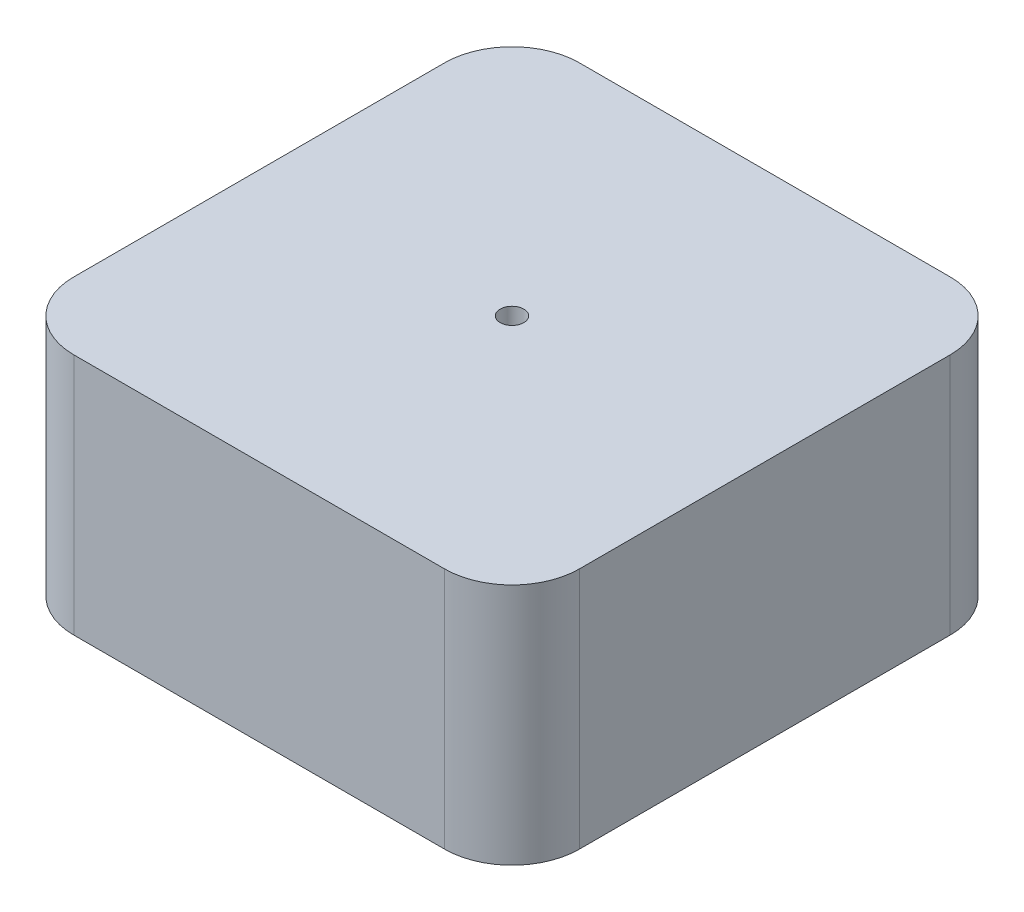
ISO-10303-21;
HEADER;
FILE_DESCRIPTION(('STEP AP214'),'2;1');
FILE_NAME('part.step','',(''),(''),'','','');
FILE_SCHEMA(('AUTOMOTIVE_DESIGN { 1 0 10303 214 1 1 1 1 }'));
ENDSEC;
DATA;
#1=APPLICATION_CONTEXT('core data for automotive mechanical design processes');
#2=APPLICATION_PROTOCOL_DEFINITION('international standard','automotive_design',2000,#1);
#3=PRODUCT_CONTEXT('',#1,'mechanical');
#4=PRODUCT('Part','Part','',(#3));
#5=PRODUCT_RELATED_PRODUCT_CATEGORY('part','',(#4));
#6=PRODUCT_DEFINITION_FORMATION('','',#4);
#7=PRODUCT_DEFINITION_CONTEXT('part definition',#1,'design');
#8=PRODUCT_DEFINITION('design','',#6,#7);
#9=PRODUCT_DEFINITION_SHAPE('','',#8);
#10=(LENGTH_UNIT() NAMED_UNIT(*) SI_UNIT(.MILLI.,.METRE.));
#11=(NAMED_UNIT(*) PLANE_ANGLE_UNIT() SI_UNIT($,.RADIAN.));
#12=(NAMED_UNIT(*) SI_UNIT($,.STERADIAN.) SOLID_ANGLE_UNIT());
#13=UNCERTAINTY_MEASURE_WITH_UNIT(LENGTH_MEASURE(1.E-05),#10,'distance_accuracy_value','');
#14=(GEOMETRIC_REPRESENTATION_CONTEXT(3) GLOBAL_UNCERTAINTY_ASSIGNED_CONTEXT((#13)) GLOBAL_UNIT_ASSIGNED_CONTEXT((#10,
#11,#12)) REPRESENTATION_CONTEXT('',''));
#15=CARTESIAN_POINT('',(0.,0.,0.));
#16=DIRECTION('',(0.,0.,1.));
#17=DIRECTION('',(1.,0.,0.));
#18=AXIS2_PLACEMENT_3D('',#15,#16,#17);
#19=CARTESIAN_POINT('',(-55.,-72.,55.));
#20=DIRECTION('',(0.,1.,0.));
#21=DIRECTION('',(0.,0.,1.));
#22=AXIS2_PLACEMENT_3D('',#19,#20,#21);
#23=CYLINDRICAL_SURFACE('',#22,20.);
#24=CARTESIAN_POINT('',(-55.,0.,55.));
#25=DIRECTION('',(0.,1.,0.));
#26=DIRECTION('',(0.,0.,1.));
#27=AXIS2_PLACEMENT_3D('',#24,#25,#26);
#28=CIRCLE('',#27,20.);
#29=CARTESIAN_POINT('',(-75.,0.,55.));
#30=VERTEX_POINT('',#29);
#31=CARTESIAN_POINT('',(-55.,0.,75.));
#32=VERTEX_POINT('',#31);
#33=EDGE_CURVE('E154',#30,#32,#28,.T.);
#34=ORIENTED_EDGE('',*,*,#33,.F.);
#35=DIRECTION('',(0.,1.,0.));
#36=VECTOR('',#35,1.);
#37=CARTESIAN_POINT('',(-75.,-72.,55.));
#38=LINE('',#37,#36);
#39=CARTESIAN_POINT('',(-75.,-72.,55.));
#40=VERTEX_POINT('',#39);
#41=EDGE_CURVE('E11',#40,#30,#38,.T.);
#42=ORIENTED_EDGE('',*,*,#41,.F.);
#43=CARTESIAN_POINT('',(-55.,-72.,55.));
#44=DIRECTION('',(0.,1.,0.));
#45=DIRECTION('',(0.,0.,1.));
#46=AXIS2_PLACEMENT_3D('',#43,#44,#45);
#47=CIRCLE('',#46,20.);
#48=CARTESIAN_POINT('',(-55.,-72.,75.));
#49=VERTEX_POINT('',#48);
#50=EDGE_CURVE('E178',#40,#49,#47,.T.);
#51=ORIENTED_EDGE('',*,*,#50,.T.);
#52=DIRECTION('',(0.,1.,0.));
#53=VECTOR('',#52,1.);
#54=CARTESIAN_POINT('',(-55.,-72.,75.));
#55=LINE('',#54,#53);
#56=EDGE_CURVE('E106',#49,#32,#55,.T.);
#57=ORIENTED_EDGE('',*,*,#56,.T.);
#58=EDGE_LOOP('',(#34,#42,#51,#57));
#59=FACE_BOUND('',#58,.T.);
#60=ADVANCED_FACE('F42',(#59),#23,.T.);
#61=CARTESIAN_POINT('',(-75.,-72.,55.));
#62=DIRECTION('',(-1.,0.,0.));
#63=DIRECTION('',(0.,0.,1.));
#64=AXIS2_PLACEMENT_3D('',#61,#62,#63);
#65=PLANE('',#64);
#66=DIRECTION('',(0.,0.,1.));
#67=VECTOR('',#66,1.);
#68=CARTESIAN_POINT('',(-75.,0.,55.));
#69=LINE('',#68,#67);
#70=CARTESIAN_POINT('',(-75.,0.,-55.));
#71=VERTEX_POINT('',#70);
#72=EDGE_CURVE('E171',#71,#30,#69,.T.);
#73=ORIENTED_EDGE('',*,*,#72,.F.);
#74=DIRECTION('',(0.,1.,0.));
#75=VECTOR('',#74,1.);
#76=CARTESIAN_POINT('',(-75.,-72.,-55.));
#77=LINE('',#76,#75);
#78=CARTESIAN_POINT('',(-75.,-72.,-55.));
#79=VERTEX_POINT('',#78);
#80=EDGE_CURVE('E55',#79,#71,#77,.T.);
#81=ORIENTED_EDGE('',*,*,#80,.F.);
#82=DIRECTION('',(0.,0.,1.));
#83=VECTOR('',#82,1.);
#84=CARTESIAN_POINT('',(-75.,-72.,55.));
#85=LINE('',#84,#83);
#86=EDGE_CURVE('E144',#79,#40,#85,.T.);
#87=ORIENTED_EDGE('',*,*,#86,.T.);
#88=ORIENTED_EDGE('',*,*,#41,.T.);
#89=EDGE_LOOP('',(#73,#81,#87,#88));
#90=FACE_BOUND('',#89,.T.);
#91=ADVANCED_FACE('F186',(#90),#65,.T.);
#92=CARTESIAN_POINT('',(-55.,-72.,-55.));
#93=DIRECTION('',(0.,1.,0.));
#94=DIRECTION('',(0.,0.,1.));
#95=AXIS2_PLACEMENT_3D('',#92,#93,#94);
#96=CYLINDRICAL_SURFACE('',#95,20.);
#97=CARTESIAN_POINT('',(-55.,0.,-55.));
#98=DIRECTION('',(0.,1.,0.));
#99=DIRECTION('',(0.,0.,-1.));
#100=AXIS2_PLACEMENT_3D('',#97,#98,#99);
#101=CIRCLE('',#100,20.);
#102=CARTESIAN_POINT('',(-55.,0.,-75.));
#103=VERTEX_POINT('',#102);
#104=EDGE_CURVE('E135',#103,#71,#101,.T.);
#105=ORIENTED_EDGE('',*,*,#104,.F.);
#106=DIRECTION('',(0.,1.,0.));
#107=VECTOR('',#106,1.);
#108=CARTESIAN_POINT('',(-55.,-72.,-75.));
#109=LINE('',#108,#107);
#110=CARTESIAN_POINT('',(-55.,-72.,-75.));
#111=VERTEX_POINT('',#110);
#112=EDGE_CURVE('E127',#111,#103,#109,.T.);
#113=ORIENTED_EDGE('',*,*,#112,.F.);
#114=CARTESIAN_POINT('',(-55.,-72.,-55.));
#115=DIRECTION('',(0.,1.,0.));
#116=DIRECTION('',(0.,0.,-1.));
#117=AXIS2_PLACEMENT_3D('',#114,#115,#116);
#118=CIRCLE('',#117,20.);
#119=EDGE_CURVE('E129',#111,#79,#118,.T.);
#120=ORIENTED_EDGE('',*,*,#119,.T.);
#121=ORIENTED_EDGE('',*,*,#80,.T.);
#122=EDGE_LOOP('',(#105,#113,#120,#121));
#123=FACE_BOUND('',#122,.T.);
#124=ADVANCED_FACE('F126',(#123),#96,.T.);
#125=CARTESIAN_POINT('',(-55.,-72.,-75.));
#126=DIRECTION('',(0.,0.,-1.));
#127=DIRECTION('',(-1.,0.,0.));
#128=AXIS2_PLACEMENT_3D('',#125,#126,#127);
#129=PLANE('',#128);
#130=DIRECTION('',(-1.,0.,0.));
#131=VECTOR('',#130,1.);
#132=CARTESIAN_POINT('',(-55.,0.,-75.));
#133=LINE('',#132,#131);
#134=CARTESIAN_POINT('',(55.,0.,-75.));
#135=VERTEX_POINT('',#134);
#136=EDGE_CURVE('E172',#135,#103,#133,.T.);
#137=ORIENTED_EDGE('',*,*,#136,.F.);
#138=DIRECTION('',(0.,1.,0.));
#139=VECTOR('',#138,1.);
#140=CARTESIAN_POINT('',(55.,-72.,-75.));
#141=LINE('',#140,#139);
#142=CARTESIAN_POINT('',(55.,-72.,-75.));
#143=VERTEX_POINT('',#142);
#144=EDGE_CURVE('E137',#143,#135,#141,.T.);
#145=ORIENTED_EDGE('',*,*,#144,.F.);
#146=DIRECTION('',(-1.,0.,0.));
#147=VECTOR('',#146,1.);
#148=CARTESIAN_POINT('',(-55.,-72.,-75.));
#149=LINE('',#148,#147);
#150=EDGE_CURVE('E141',#143,#111,#149,.T.);
#151=ORIENTED_EDGE('',*,*,#150,.T.);
#152=ORIENTED_EDGE('',*,*,#112,.T.);
#153=EDGE_LOOP('',(#137,#145,#151,#152));
#154=FACE_BOUND('',#153,.T.);
#155=ADVANCED_FACE('F150',(#154),#129,.T.);
#156=CARTESIAN_POINT('',(55.,-72.,-55.));
#157=DIRECTION('',(0.,1.,0.));
#158=DIRECTION('',(0.,0.,1.));
#159=AXIS2_PLACEMENT_3D('',#156,#157,#158);
#160=CYLINDRICAL_SURFACE('',#159,20.);
#161=CARTESIAN_POINT('',(55.,0.,-55.));
#162=DIRECTION('',(0.,1.,0.));
#163=DIRECTION('',(0.,0.,1.));
#164=AXIS2_PLACEMENT_3D('',#161,#162,#163);
#165=CIRCLE('',#164,20.);
#166=CARTESIAN_POINT('',(75.,0.,-55.));
#167=VERTEX_POINT('',#166);
#168=EDGE_CURVE('E169',#167,#135,#165,.T.);
#169=ORIENTED_EDGE('',*,*,#168,.F.);
#170=DIRECTION('',(0.,1.,0.));
#171=VECTOR('',#170,1.);
#172=CARTESIAN_POINT('',(75.,-72.,-55.));
#173=LINE('',#172,#171);
#174=CARTESIAN_POINT('',(75.,-72.,-55.));
#175=VERTEX_POINT('',#174);
#176=EDGE_CURVE('E177',#175,#167,#173,.T.);
#177=ORIENTED_EDGE('',*,*,#176,.F.);
#178=CARTESIAN_POINT('',(55.,-72.,-55.));
#179=DIRECTION('',(0.,1.,0.));
#180=DIRECTION('',(0.,0.,1.));
#181=AXIS2_PLACEMENT_3D('',#178,#179,#180);
#182=CIRCLE('',#181,20.);
#183=EDGE_CURVE('E146',#175,#143,#182,.T.);
#184=ORIENTED_EDGE('',*,*,#183,.T.);
#185=ORIENTED_EDGE('',*,*,#144,.T.);
#186=EDGE_LOOP('',(#169,#177,#184,#185));
#187=FACE_BOUND('',#186,.T.);
#188=ADVANCED_FACE('F205',(#187),#160,.T.);
#189=CARTESIAN_POINT('',(75.,-72.,55.));
#190=DIRECTION('',(1.,0.,0.));
#191=DIRECTION('',(0.,0.,-1.));
#192=AXIS2_PLACEMENT_3D('',#189,#190,#191);
#193=PLANE('',#192);
#194=DIRECTION('',(0.,0.,-1.));
#195=VECTOR('',#194,1.);
#196=CARTESIAN_POINT('',(75.,0.,55.));
#197=LINE('',#196,#195);
#198=CARTESIAN_POINT('',(75.,0.,55.));
#199=VERTEX_POINT('',#198);
#200=EDGE_CURVE('E164',#199,#167,#197,.T.);
#201=ORIENTED_EDGE('',*,*,#200,.F.);
#202=DIRECTION('',(0.,1.,0.));
#203=VECTOR('',#202,1.);
#204=CARTESIAN_POINT('',(75.,-72.,55.));
#205=LINE('',#204,#203);
#206=CARTESIAN_POINT('',(75.,-72.,55.));
#207=VERTEX_POINT('',#206);
#208=EDGE_CURVE('E185',#207,#199,#205,.T.);
#209=ORIENTED_EDGE('',*,*,#208,.F.);
#210=DIRECTION('',(0.,0.,-1.));
#211=VECTOR('',#210,1.);
#212=CARTESIAN_POINT('',(75.,-72.,55.));
#213=LINE('',#212,#211);
#214=EDGE_CURVE('E147',#207,#175,#213,.T.);
#215=ORIENTED_EDGE('',*,*,#214,.T.);
#216=ORIENTED_EDGE('',*,*,#176,.T.);
#217=EDGE_LOOP('',(#201,#209,#215,#216));
#218=FACE_BOUND('',#217,.T.);
#219=ADVANCED_FACE('F202',(#218),#193,.T.);
#220=CARTESIAN_POINT('',(55.,-72.,55.));
#221=DIRECTION('',(0.,1.,0.));
#222=DIRECTION('',(0.,0.,1.));
#223=AXIS2_PLACEMENT_3D('',#220,#221,#222);
#224=CYLINDRICAL_SURFACE('',#223,20.);
#225=CARTESIAN_POINT('',(55.,0.,55.));
#226=DIRECTION('',(0.,1.,0.));
#227=DIRECTION('',(0.,0.,1.));
#228=AXIS2_PLACEMENT_3D('',#225,#226,#227);
#229=CIRCLE('',#228,20.);
#230=CARTESIAN_POINT('',(55.,0.,75.));
#231=VERTEX_POINT('',#230);
#232=EDGE_CURVE('E165',#231,#199,#229,.T.);
#233=ORIENTED_EDGE('',*,*,#232,.F.);
#234=DIRECTION('',(0.,1.,0.));
#235=VECTOR('',#234,1.);
#236=CARTESIAN_POINT('',(55.,-72.,75.));
#237=LINE('',#236,#235);
#238=CARTESIAN_POINT('',(55.,-72.,75.));
#239=VERTEX_POINT('',#238);
#240=EDGE_CURVE('E184',#239,#231,#237,.T.);
#241=ORIENTED_EDGE('',*,*,#240,.F.);
#242=CARTESIAN_POINT('',(55.,-72.,55.));
#243=DIRECTION('',(0.,1.,0.));
#244=DIRECTION('',(0.,0.,1.));
#245=AXIS2_PLACEMENT_3D('',#242,#243,#244);
#246=CIRCLE('',#245,20.);
#247=EDGE_CURVE('E345',#239,#207,#246,.T.);
#248=ORIENTED_EDGE('',*,*,#247,.T.);
#249=ORIENTED_EDGE('',*,*,#208,.T.);
#250=EDGE_LOOP('',(#233,#241,#248,#249));
#251=FACE_BOUND('',#250,.T.);
#252=ADVANCED_FACE('F207',(#251),#224,.T.);
#253=CARTESIAN_POINT('',(-55.,-72.,75.));
#254=DIRECTION('',(0.,0.,1.));
#255=DIRECTION('',(1.,0.,0.));
#256=AXIS2_PLACEMENT_3D('',#253,#254,#255);
#257=PLANE('',#256);
#258=DIRECTION('',(1.,0.,0.));
#259=VECTOR('',#258,1.);
#260=CARTESIAN_POINT('',(-55.,0.,75.));
#261=LINE('',#260,#259);
#262=EDGE_CURVE('E158',#32,#231,#261,.T.);
#263=ORIENTED_EDGE('',*,*,#262,.F.);
#264=ORIENTED_EDGE('',*,*,#56,.F.);
#265=DIRECTION('',(1.,0.,0.));
#266=VECTOR('',#265,1.);
#267=CARTESIAN_POINT('',(-55.,-72.,75.));
#268=LINE('',#267,#266);
#269=EDGE_CURVE('E338',#49,#239,#268,.T.);
#270=ORIENTED_EDGE('',*,*,#269,.T.);
#271=ORIENTED_EDGE('',*,*,#240,.T.);
#272=EDGE_LOOP('',(#263,#264,#270,#271));
#273=FACE_BOUND('',#272,.T.);
#274=ADVANCED_FACE('F183',(#273),#257,.T.);
#275=CARTESIAN_POINT('',(-55.,-72.,55.));
#276=DIRECTION('',(0.,1.,0.));
#277=DIRECTION('',(0.,0.,1.));
#278=AXIS2_PLACEMENT_3D('',#275,#276,#277);
#279=PLANE('',#278);
#280=DIRECTION('',(0.,0.,1.));
#281=VECTOR('',#280,1.);
#282=CARTESIAN_POINT('',(-70.,-72.,55.));
#283=LINE('',#282,#281);
#284=CARTESIAN_POINT('',(-70.,-72.,-55.));
#285=VERTEX_POINT('',#284);
#286=CARTESIAN_POINT('',(-70.,-72.,55.));
#287=VERTEX_POINT('',#286);
#288=EDGE_CURVE('E284',#285,#287,#283,.T.);
#289=ORIENTED_EDGE('',*,*,#288,.T.);
#290=CARTESIAN_POINT('',(-55.,-72.,55.));
#291=DIRECTION('',(0.,1.,0.));
#292=DIRECTION('',(0.,0.,1.));
#293=AXIS2_PLACEMENT_3D('',#290,#291,#292);
#294=CIRCLE('',#293,15.);
#295=CARTESIAN_POINT('',(-55.,-72.,70.));
#296=VERTEX_POINT('',#295);
#297=EDGE_CURVE('E290',#287,#296,#294,.T.);
#298=ORIENTED_EDGE('',*,*,#297,.T.);
#299=DIRECTION('',(1.,0.,0.));
#300=VECTOR('',#299,1.);
#301=CARTESIAN_POINT('',(-55.,-72.,70.));
#302=LINE('',#301,#300);
#303=CARTESIAN_POINT('',(55.,-72.,70.));
#304=VERTEX_POINT('',#303);
#305=EDGE_CURVE('E325',#296,#304,#302,.T.);
#306=ORIENTED_EDGE('',*,*,#305,.T.);
#307=CARTESIAN_POINT('',(55.,-72.,55.));
#308=DIRECTION('',(0.,1.,0.));
#309=DIRECTION('',(0.,0.,1.));
#310=AXIS2_PLACEMENT_3D('',#307,#308,#309);
#311=CIRCLE('',#310,15.);
#312=CARTESIAN_POINT('',(70.,-72.,55.));
#313=VERTEX_POINT('',#312);
#314=EDGE_CURVE('E58',#304,#313,#311,.T.);
#315=ORIENTED_EDGE('',*,*,#314,.T.);
#316=DIRECTION('',(0.,0.,-1.));
#317=VECTOR('',#316,1.);
#318=CARTESIAN_POINT('',(70.,-72.,55.));
#319=LINE('',#318,#317);
#320=CARTESIAN_POINT('',(70.,-72.,-55.));
#321=VERTEX_POINT('',#320);
#322=EDGE_CURVE('E334',#313,#321,#319,.T.);
#323=ORIENTED_EDGE('',*,*,#322,.T.);
#324=CARTESIAN_POINT('',(55.,-72.,-55.));
#325=DIRECTION('',(0.,1.,0.));
#326=DIRECTION('',(0.,0.,1.));
#327=AXIS2_PLACEMENT_3D('',#324,#325,#326);
#328=CIRCLE('',#327,15.);
#329=CARTESIAN_POINT('',(55.,-72.,-70.));
#330=VERTEX_POINT('',#329);
#331=EDGE_CURVE('E329',#321,#330,#328,.T.);
#332=ORIENTED_EDGE('',*,*,#331,.T.);
#333=DIRECTION('',(-1.,0.,0.));
#334=VECTOR('',#333,1.);
#335=CARTESIAN_POINT('',(-55.,-72.,-70.));
#336=LINE('',#335,#334);
#337=CARTESIAN_POINT('',(-55.,-72.,-70.));
#338=VERTEX_POINT('',#337);
#339=EDGE_CURVE('E330',#330,#338,#336,.T.);
#340=ORIENTED_EDGE('',*,*,#339,.T.);
#341=CARTESIAN_POINT('',(-55.,-72.,-55.));
#342=DIRECTION('',(0.,1.,0.));
#343=DIRECTION('',(0.,0.,1.));
#344=AXIS2_PLACEMENT_3D('',#341,#342,#343);
#345=CIRCLE('',#344,15.);
#346=EDGE_CURVE('E322',#338,#285,#345,.T.);
#347=ORIENTED_EDGE('',*,*,#346,.T.);
#348=EDGE_LOOP('',(#289,#298,#306,#315,#323,#332,#340,#347));
#349=FACE_BOUND('',#348,.T.);
#350=ORIENTED_EDGE('',*,*,#50,.F.);
#351=ORIENTED_EDGE('',*,*,#86,.F.);
#352=ORIENTED_EDGE('',*,*,#119,.F.);
#353=ORIENTED_EDGE('',*,*,#150,.F.);
#354=ORIENTED_EDGE('',*,*,#183,.F.);
#355=ORIENTED_EDGE('',*,*,#214,.F.);
#356=ORIENTED_EDGE('',*,*,#247,.F.);
#357=ORIENTED_EDGE('',*,*,#269,.F.);
#358=EDGE_LOOP('',(#350,#351,#352,#353,#354,#355,#356,#357));
#359=FACE_BOUND('',#358,.T.);
#360=ADVANCED_FACE('F143',(#349,#359),#279,.F.);
#361=CARTESIAN_POINT('',(-55.,0.,55.));
#362=DIRECTION('',(0.,1.,0.));
#363=DIRECTION('',(0.,0.,1.));
#364=AXIS2_PLACEMENT_3D('',#361,#362,#363);
#365=PLANE('',#364);
#366=CARTESIAN_POINT('',(0.,0.,0.));
#367=DIRECTION('',(0.,1.,0.));
#368=DIRECTION('',(0.,0.,1.));
#369=AXIS2_PLACEMENT_3D('',#366,#367,#368);
#370=CIRCLE('',#369,3.5);
#371=CARTESIAN_POINT('',(0.,0.,3.5));
#372=VERTEX_POINT('',#371);
#373=EDGE_CURVE('E270',#372,#372,#370,.T.);
#374=ORIENTED_EDGE('',*,*,#373,.F.);
#375=EDGE_LOOP('',(#374));
#376=FACE_BOUND('',#375,.T.);
#377=ORIENTED_EDGE('',*,*,#33,.T.);
#378=ORIENTED_EDGE('',*,*,#262,.T.);
#379=ORIENTED_EDGE('',*,*,#232,.T.);
#380=ORIENTED_EDGE('',*,*,#200,.T.);
#381=ORIENTED_EDGE('',*,*,#168,.T.);
#382=ORIENTED_EDGE('',*,*,#136,.T.);
#383=ORIENTED_EDGE('',*,*,#104,.T.);
#384=ORIENTED_EDGE('',*,*,#72,.T.);
#385=EDGE_LOOP('',(#377,#378,#379,#380,#381,#382,#383,#384));
#386=FACE_BOUND('',#385,.T.);
#387=ADVANCED_FACE('F189',(#376,#386),#365,.T.);
#388=CARTESIAN_POINT('',(-55.,-72.,55.));
#389=DIRECTION('',(0.,1.,0.));
#390=DIRECTION('',(0.,0.,1.));
#391=AXIS2_PLACEMENT_3D('',#388,#389,#390);
#392=CYLINDRICAL_SURFACE('',#391,15.);
#393=CARTESIAN_POINT('',(-55.,-5.,55.));
#394=DIRECTION('',(0.,1.,0.));
#395=DIRECTION('',(0.,0.,1.));
#396=AXIS2_PLACEMENT_3D('',#393,#394,#395);
#397=CIRCLE('',#396,15.);
#398=CARTESIAN_POINT('',(-70.,-5.,55.));
#399=VERTEX_POINT('',#398);
#400=CARTESIAN_POINT('',(-55.,-5.,70.));
#401=VERTEX_POINT('',#400);
#402=EDGE_CURVE('E269',#399,#401,#397,.T.);
#403=ORIENTED_EDGE('',*,*,#402,.T.);
#404=DIRECTION('',(0.,1.,0.));
#405=VECTOR('',#404,1.);
#406=CARTESIAN_POINT('',(-55.,-72.,70.));
#407=LINE('',#406,#405);
#408=EDGE_CURVE('E276',#296,#401,#407,.T.);
#409=ORIENTED_EDGE('',*,*,#408,.F.);
#410=ORIENTED_EDGE('',*,*,#297,.F.);
#411=DIRECTION('',(0.,1.,0.));
#412=VECTOR('',#411,1.);
#413=CARTESIAN_POINT('',(-70.,-72.,55.));
#414=LINE('',#413,#412);
#415=EDGE_CURVE('E157',#287,#399,#414,.T.);
#416=ORIENTED_EDGE('',*,*,#415,.T.);
#417=EDGE_LOOP('',(#403,#409,#410,#416));
#418=FACE_BOUND('',#417,.T.);
#419=ADVANCED_FACE('F225',(#418),#392,.F.);
#420=CARTESIAN_POINT('',(-70.,-72.,55.));
#421=DIRECTION('',(-1.,0.,0.));
#422=DIRECTION('',(0.,0.,1.));
#423=AXIS2_PLACEMENT_3D('',#420,#421,#422);
#424=PLANE('',#423);
#425=DIRECTION('',(0.,0.,1.));
#426=VECTOR('',#425,1.);
#427=CARTESIAN_POINT('',(-70.,-5.,55.));
#428=LINE('',#427,#426);
#429=CARTESIAN_POINT('',(-70.,-5.,-55.));
#430=VERTEX_POINT('',#429);
#431=EDGE_CURVE('E281',#430,#399,#428,.T.);
#432=ORIENTED_EDGE('',*,*,#431,.T.);
#433=ORIENTED_EDGE('',*,*,#415,.F.);
#434=ORIENTED_EDGE('',*,*,#288,.F.);
#435=DIRECTION('',(0.,1.,0.));
#436=VECTOR('',#435,1.);
#437=CARTESIAN_POINT('',(-70.,-72.,-55.));
#438=LINE('',#437,#436);
#439=EDGE_CURVE('E279',#285,#430,#438,.T.);
#440=ORIENTED_EDGE('',*,*,#439,.T.);
#441=EDGE_LOOP('',(#432,#433,#434,#440));
#442=FACE_BOUND('',#441,.T.);
#443=ADVANCED_FACE('F251',(#442),#424,.F.);
#444=CARTESIAN_POINT('',(-55.,-72.,-55.));
#445=DIRECTION('',(0.,1.,0.));
#446=DIRECTION('',(0.,0.,1.));
#447=AXIS2_PLACEMENT_3D('',#444,#445,#446);
#448=CYLINDRICAL_SURFACE('',#447,15.);
#449=CARTESIAN_POINT('',(-55.,-5.,-55.));
#450=DIRECTION('',(0.,1.,0.));
#451=DIRECTION('',(0.,0.,1.));
#452=AXIS2_PLACEMENT_3D('',#449,#450,#451);
#453=CIRCLE('',#452,15.);
#454=CARTESIAN_POINT('',(-55.,-5.,-70.));
#455=VERTEX_POINT('',#454);
#456=EDGE_CURVE('E286',#455,#430,#453,.T.);
#457=ORIENTED_EDGE('',*,*,#456,.T.);
#458=ORIENTED_EDGE('',*,*,#439,.F.);
#459=ORIENTED_EDGE('',*,*,#346,.F.);
#460=DIRECTION('',(0.,1.,0.));
#461=VECTOR('',#460,1.);
#462=CARTESIAN_POINT('',(-55.,-72.,-70.));
#463=LINE('',#462,#461);
#464=EDGE_CURVE('E292',#338,#455,#463,.T.);
#465=ORIENTED_EDGE('',*,*,#464,.T.);
#466=EDGE_LOOP('',(#457,#458,#459,#465));
#467=FACE_BOUND('',#466,.T.);
#468=ADVANCED_FACE('F248',(#467),#448,.F.);
#469=CARTESIAN_POINT('',(-55.,-72.,-70.));
#470=DIRECTION('',(0.,0.,-1.));
#471=DIRECTION('',(-1.,0.,0.));
#472=AXIS2_PLACEMENT_3D('',#469,#470,#471);
#473=PLANE('',#472);
#474=DIRECTION('',(-1.,0.,0.));
#475=VECTOR('',#474,1.);
#476=CARTESIAN_POINT('',(-55.,-5.,-70.));
#477=LINE('',#476,#475);
#478=CARTESIAN_POINT('',(55.,-5.,-70.));
#479=VERTEX_POINT('',#478);
#480=EDGE_CURVE('E294',#479,#455,#477,.T.);
#481=ORIENTED_EDGE('',*,*,#480,.T.);
#482=ORIENTED_EDGE('',*,*,#464,.F.);
#483=ORIENTED_EDGE('',*,*,#339,.F.);
#484=DIRECTION('',(0.,1.,0.));
#485=VECTOR('',#484,1.);
#486=CARTESIAN_POINT('',(55.,-72.,-70.));
#487=LINE('',#486,#485);
#488=EDGE_CURVE('E300',#330,#479,#487,.T.);
#489=ORIENTED_EDGE('',*,*,#488,.T.);
#490=EDGE_LOOP('',(#481,#482,#483,#489));
#491=FACE_BOUND('',#490,.T.);
#492=ADVANCED_FACE('F243',(#491),#473,.F.);
#493=CARTESIAN_POINT('',(55.,-72.,-55.));
#494=DIRECTION('',(0.,1.,0.));
#495=DIRECTION('',(0.,0.,1.));
#496=AXIS2_PLACEMENT_3D('',#493,#494,#495);
#497=CYLINDRICAL_SURFACE('',#496,15.);
#498=CARTESIAN_POINT('',(55.,-5.,-55.));
#499=DIRECTION('',(0.,1.,0.));
#500=DIRECTION('',(0.,0.,1.));
#501=AXIS2_PLACEMENT_3D('',#498,#499,#500);
#502=CIRCLE('',#501,15.);
#503=CARTESIAN_POINT('',(70.,-5.,-55.));
#504=VERTEX_POINT('',#503);
#505=EDGE_CURVE('E298',#504,#479,#502,.T.);
#506=ORIENTED_EDGE('',*,*,#505,.T.);
#507=ORIENTED_EDGE('',*,*,#488,.F.);
#508=ORIENTED_EDGE('',*,*,#331,.F.);
#509=DIRECTION('',(0.,1.,0.));
#510=VECTOR('',#509,1.);
#511=CARTESIAN_POINT('',(70.,-72.,-55.));
#512=LINE('',#511,#510);
#513=EDGE_CURVE('E304',#321,#504,#512,.T.);
#514=ORIENTED_EDGE('',*,*,#513,.T.);
#515=EDGE_LOOP('',(#506,#507,#508,#514));
#516=FACE_BOUND('',#515,.T.);
#517=ADVANCED_FACE('F242',(#516),#497,.F.);
#518=CARTESIAN_POINT('',(70.,-72.,55.));
#519=DIRECTION('',(1.,0.,0.));
#520=DIRECTION('',(0.,0.,-1.));
#521=AXIS2_PLACEMENT_3D('',#518,#519,#520);
#522=PLANE('',#521);
#523=DIRECTION('',(0.,0.,-1.));
#524=VECTOR('',#523,1.);
#525=CARTESIAN_POINT('',(70.,-5.,55.));
#526=LINE('',#525,#524);
#527=CARTESIAN_POINT('',(70.,-5.,55.));
#528=VERTEX_POINT('',#527);
#529=EDGE_CURVE('E308',#528,#504,#526,.T.);
#530=ORIENTED_EDGE('',*,*,#529,.T.);
#531=ORIENTED_EDGE('',*,*,#513,.F.);
#532=ORIENTED_EDGE('',*,*,#322,.F.);
#533=DIRECTION('',(0.,1.,0.));
#534=VECTOR('',#533,1.);
#535=CARTESIAN_POINT('',(70.,-72.,55.));
#536=LINE('',#535,#534);
#537=EDGE_CURVE('E310',#313,#528,#536,.T.);
#538=ORIENTED_EDGE('',*,*,#537,.T.);
#539=EDGE_LOOP('',(#530,#531,#532,#538));
#540=FACE_BOUND('',#539,.T.);
#541=ADVANCED_FACE('F236',(#540),#522,.F.);
#542=CARTESIAN_POINT('',(55.,-72.,55.));
#543=DIRECTION('',(0.,1.,0.));
#544=DIRECTION('',(0.,0.,1.));
#545=AXIS2_PLACEMENT_3D('',#542,#543,#544);
#546=CYLINDRICAL_SURFACE('',#545,15.);
#547=CARTESIAN_POINT('',(55.,-5.,55.));
#548=DIRECTION('',(0.,1.,0.));
#549=DIRECTION('',(0.,0.,1.));
#550=AXIS2_PLACEMENT_3D('',#547,#548,#549);
#551=CIRCLE('',#550,15.);
#552=CARTESIAN_POINT('',(55.,-5.,70.));
#553=VERTEX_POINT('',#552);
#554=EDGE_CURVE('E315',#553,#528,#551,.T.);
#555=ORIENTED_EDGE('',*,*,#554,.T.);
#556=ORIENTED_EDGE('',*,*,#537,.F.);
#557=ORIENTED_EDGE('',*,*,#314,.F.);
#558=DIRECTION('',(0.,1.,0.));
#559=VECTOR('',#558,1.);
#560=CARTESIAN_POINT('',(55.,-72.,70.));
#561=LINE('',#560,#559);
#562=EDGE_CURVE('E285',#304,#553,#561,.T.);
#563=ORIENTED_EDGE('',*,*,#562,.T.);
#564=EDGE_LOOP('',(#555,#556,#557,#563));
#565=FACE_BOUND('',#564,.T.);
#566=ADVANCED_FACE('F234',(#565),#546,.F.);
#567=CARTESIAN_POINT('',(-55.,-72.,70.));
#568=DIRECTION('',(0.,0.,1.));
#569=DIRECTION('',(1.,0.,0.));
#570=AXIS2_PLACEMENT_3D('',#567,#568,#569);
#571=PLANE('',#570);
#572=DIRECTION('',(1.,0.,0.));
#573=VECTOR('',#572,1.);
#574=CARTESIAN_POINT('',(-55.,-5.,70.));
#575=LINE('',#574,#573);
#576=EDGE_CURVE('E275',#401,#553,#575,.T.);
#577=ORIENTED_EDGE('',*,*,#576,.T.);
#578=ORIENTED_EDGE('',*,*,#562,.F.);
#579=ORIENTED_EDGE('',*,*,#305,.F.);
#580=ORIENTED_EDGE('',*,*,#408,.T.);
#581=EDGE_LOOP('',(#577,#578,#579,#580));
#582=FACE_BOUND('',#581,.T.);
#583=ADVANCED_FACE('F228',(#582),#571,.F.);
#584=CARTESIAN_POINT('',(-55.,-5.,55.));
#585=DIRECTION('',(0.,1.,0.));
#586=DIRECTION('',(0.,0.,1.));
#587=AXIS2_PLACEMENT_3D('',#584,#585,#586);
#588=PLANE('',#587);
#589=CARTESIAN_POINT('',(0.,-5.,0.));
#590=DIRECTION('',(0.,1.,0.));
#591=DIRECTION('',(0.,0.,1.));
#592=AXIS2_PLACEMENT_3D('',#589,#590,#591);
#593=CIRCLE('',#592,3.5);
#594=CARTESIAN_POINT('',(0.,-5.,3.5));
#595=VERTEX_POINT('',#594);
#596=EDGE_CURVE('E50',#595,#595,#593,.T.);
#597=ORIENTED_EDGE('',*,*,#596,.T.);
#598=EDGE_LOOP('',(#597));
#599=FACE_BOUND('',#598,.T.);
#600=ORIENTED_EDGE('',*,*,#402,.F.);
#601=ORIENTED_EDGE('',*,*,#431,.F.);
#602=ORIENTED_EDGE('',*,*,#456,.F.);
#603=ORIENTED_EDGE('',*,*,#480,.F.);
#604=ORIENTED_EDGE('',*,*,#505,.F.);
#605=ORIENTED_EDGE('',*,*,#529,.F.);
#606=ORIENTED_EDGE('',*,*,#554,.F.);
#607=ORIENTED_EDGE('',*,*,#576,.F.);
#608=EDGE_LOOP('',(#600,#601,#602,#603,#604,#605,#606,#607));
#609=FACE_BOUND('',#608,.T.);
#610=ADVANCED_FACE('F227',(#599,#609),#588,.F.);
#611=CARTESIAN_POINT('',(0.,-72.,0.));
#612=DIRECTION('',(0.,1.,0.));
#613=DIRECTION('',(0.,0.,1.));
#614=AXIS2_PLACEMENT_3D('',#611,#612,#613);
#615=CYLINDRICAL_SURFACE('',#614,3.5);
#616=ORIENTED_EDGE('',*,*,#373,.T.);
#617=EDGE_LOOP('',(#616));
#618=FACE_BOUND('',#617,.T.);
#619=ORIENTED_EDGE('',*,*,#596,.F.);
#620=EDGE_LOOP('',(#619));
#621=FACE_BOUND('',#620,.T.);
#622=ADVANCED_FACE('F226',(#618,#621),#615,.F.);
#623=CLOSED_SHELL('',(#60,#91,#124,#155,#188,#219,#252,#274,#360,#387,#419,#443,#468,#492,#517,
#541,#566,#583,#610,#622));
#624=MANIFOLD_SOLID_BREP('B2',#623);
#625=ADVANCED_BREP_SHAPE_REPRESENTATION('',(#18,#624),#14);
#626=SHAPE_DEFINITION_REPRESENTATION(#9,#625);
ENDSEC;
END-ISO-10303-21;
